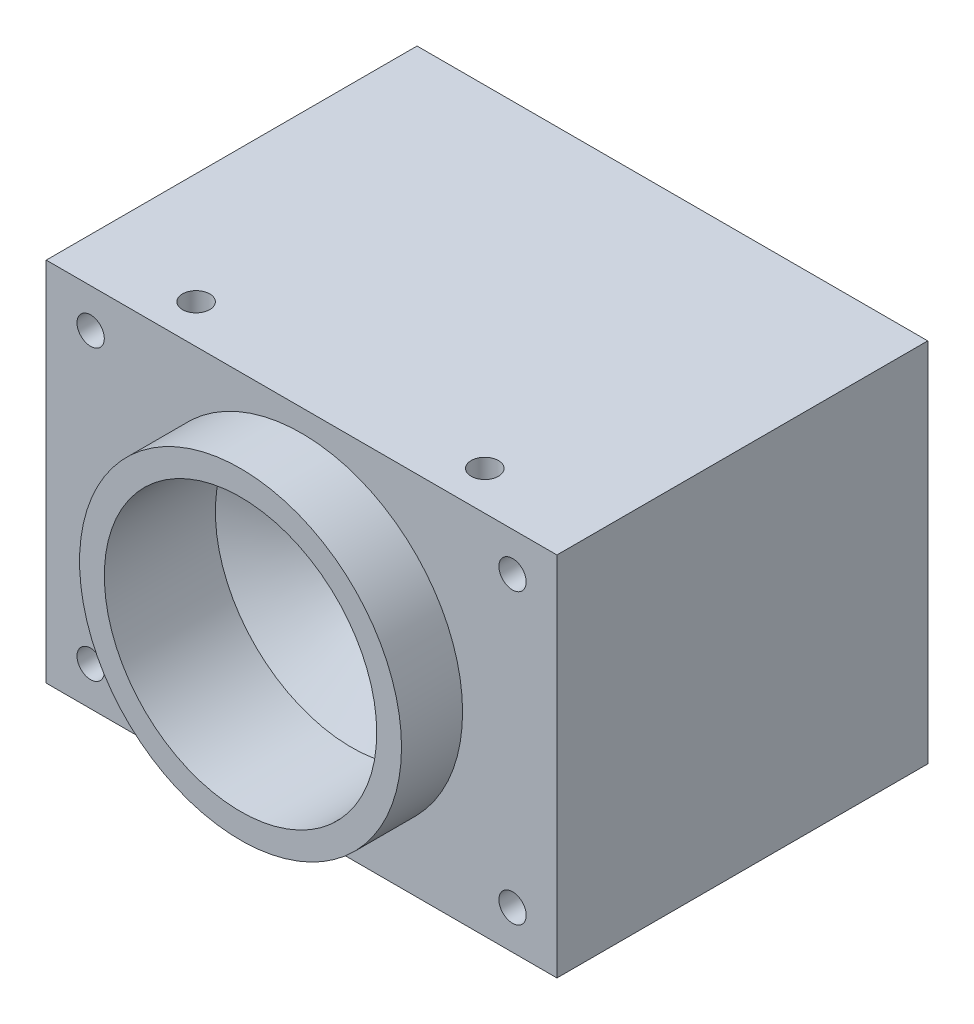
ISO-10303-21;
HEADER;
FILE_DESCRIPTION(('STEP AP214'),'2;1');
FILE_NAME('part.step','',(''),(''),'','','');
FILE_SCHEMA(('AUTOMOTIVE_DESIGN { 1 0 10303 214 1 1 1 1 }'));
ENDSEC;
DATA;
#1=APPLICATION_CONTEXT('core data for automotive mechanical design processes');
#2=APPLICATION_PROTOCOL_DEFINITION('international standard','automotive_design',2000,#1);
#3=PRODUCT_CONTEXT('',#1,'mechanical');
#4=PRODUCT('Part','Part','',(#3));
#5=PRODUCT_RELATED_PRODUCT_CATEGORY('part','',(#4));
#6=PRODUCT_DEFINITION_FORMATION('','',#4);
#7=PRODUCT_DEFINITION_CONTEXT('part definition',#1,'design');
#8=PRODUCT_DEFINITION('design','',#6,#7);
#9=PRODUCT_DEFINITION_SHAPE('','',#8);
#10=(LENGTH_UNIT() NAMED_UNIT(*) SI_UNIT(.MILLI.,.METRE.));
#11=(NAMED_UNIT(*) PLANE_ANGLE_UNIT() SI_UNIT($,.RADIAN.));
#12=(NAMED_UNIT(*) SI_UNIT($,.STERADIAN.) SOLID_ANGLE_UNIT());
#13=UNCERTAINTY_MEASURE_WITH_UNIT(LENGTH_MEASURE(1.E-05),#10,'distance_accuracy_value','');
#14=(GEOMETRIC_REPRESENTATION_CONTEXT(3) GLOBAL_UNCERTAINTY_ASSIGNED_CONTEXT((#13)) GLOBAL_UNIT_ASSIGNED_CONTEXT((#10,
#11,#12)) REPRESENTATION_CONTEXT('',''));
#15=CARTESIAN_POINT('',(0.,0.,0.));
#16=DIRECTION('',(0.,0.,1.));
#17=DIRECTION('',(1.,0.,0.));
#18=AXIS2_PLACEMENT_3D('',#15,#16,#17);
#19=CARTESIAN_POINT('',(0.,0.,28.9000000071837));
#20=DIRECTION('',(0.,0.,1.));
#21=DIRECTION('',(1.,0.,0.));
#22=AXIS2_PLACEMENT_3D('',#19,#20,#21);
#23=CONICAL_SURFACE('',#22,12.2679999955722,1.029744257486);
#24=CARTESIAN_POINT('',(-5.6843418860808E-11,0.,21.5286419158929));
#25=VERTEX_POINT('',#24);
#26=VERTEX_LOOP('',#25);
#27=FACE_BOUND('',#26,.T.);
#28=CARTESIAN_POINT('',(0.,0.,28.9));
#29=DIRECTION('',(0.,0.,1.));
#30=DIRECTION('',(1.,0.,0.));
#31=AXIS2_PLACEMENT_3D('',#28,#29,#30);
#32=CIRCLE('',#31,12.268);
#33=CARTESIAN_POINT('',(12.268,0.,28.9));
#34=VERTEX_POINT('',#33);
#35=EDGE_CURVE('E105',#34,#34,#32,.T.);
#36=ORIENTED_EDGE('',*,*,#35,.T.);
#37=EDGE_LOOP('',(#36));
#38=FACE_BOUND('',#37,.T.);
#39=ADVANCED_FACE('F16',(#27,#38),#23,.F.);
#40=CARTESIAN_POINT('',(0.,0.,33.9));
#41=DIRECTION('',(0.,0.,1.));
#42=DIRECTION('',(1.,0.,0.));
#43=AXIS2_PLACEMENT_3D('',#40,#41,#42);
#44=CYLINDRICAL_SURFACE('',#43,12.268);
#45=ORIENTED_EDGE('',*,*,#35,.F.);
#46=EDGE_LOOP('',(#45));
#47=FACE_BOUND('',#46,.T.);
#48=CARTESIAN_POINT('',(0.,0.,38.9));
#49=DIRECTION('',(0.,0.,1.));
#50=DIRECTION('',(1.,0.,0.));
#51=AXIS2_PLACEMENT_3D('',#48,#49,#50);
#52=CIRCLE('',#51,12.268);
#53=CARTESIAN_POINT('',(12.268,0.,38.9));
#54=VERTEX_POINT('',#53);
#55=EDGE_CURVE('E19',#54,#54,#52,.T.);
#56=ORIENTED_EDGE('',*,*,#55,.T.);
#57=EDGE_LOOP('',(#56));
#58=FACE_BOUND('',#57,.T.);
#59=ADVANCED_FACE('F102',(#47,#58),#44,.F.);
#60=CARTESIAN_POINT('',(-13.,12.5000000006708,29.9));
#61=DIRECTION('',(0.,1.,0.));
#62=DIRECTION('',(0.,0.,1.));
#63=AXIS2_PLACEMENT_3D('',#60,#61,#62);
#64=CONICAL_SURFACE('',#63,1.22949999942012,1.02974425728898);
#65=CARTESIAN_POINT('',(-13.0000000001473,11.7612418678732,29.9));
#66=VERTEX_POINT('',#65);
#67=VERTEX_LOOP('',#66);
#68=FACE_BOUND('',#67,.T.);
#69=CARTESIAN_POINT('',(-13.,12.5,29.9));
#70=DIRECTION('',(0.,1.,0.));
#71=DIRECTION('',(-1.,0.,0.));
#72=AXIS2_PLACEMENT_3D('',#69,#70,#71);
#73=CIRCLE('',#72,1.2295);
#74=CARTESIAN_POINT('',(-14.2295,12.5,29.9));
#75=VERTEX_POINT('',#74);
#76=EDGE_CURVE('E114',#75,#75,#73,.T.);
#77=ORIENTED_EDGE('',*,*,#76,.T.);
#78=EDGE_LOOP('',(#77));
#79=FACE_BOUND('',#78,.T.);
#80=ADVANCED_FACE('F198',(#68,#79),#64,.F.);
#81=CARTESIAN_POINT('',(13.,12.5000000006708,29.9));
#82=DIRECTION('',(0.,1.,0.));
#83=DIRECTION('',(0.,0.,1.));
#84=AXIS2_PLACEMENT_3D('',#81,#82,#83);
#85=CONICAL_SURFACE('',#84,1.22949999948743,1.02974425737128);
#86=CARTESIAN_POINT('',(12.99999999992,11.7612418678732,29.9));
#87=VERTEX_POINT('',#86);
#88=VERTEX_LOOP('',#87);
#89=FACE_BOUND('',#88,.T.);
#90=CARTESIAN_POINT('',(13.,12.5,29.9));
#91=DIRECTION('',(0.,1.,0.));
#92=DIRECTION('',(-1.,0.,0.));
#93=AXIS2_PLACEMENT_3D('',#90,#91,#92);
#94=CIRCLE('',#93,1.2295);
#95=CARTESIAN_POINT('',(11.7705,12.5,29.9));
#96=VERTEX_POINT('',#95);
#97=EDGE_CURVE('E186',#96,#96,#94,.T.);
#98=ORIENTED_EDGE('',*,*,#97,.T.);
#99=EDGE_LOOP('',(#98));
#100=FACE_BOUND('',#99,.T.);
#101=ADVANCED_FACE('F349',(#89,#100),#85,.F.);
#102=CARTESIAN_POINT('',(19.,13.,29.4000000007486));
#103=DIRECTION('',(0.,0.,1.));
#104=DIRECTION('',(1.,0.,0.));
#105=AXIS2_PLACEMENT_3D('',#102,#103,#104);
#106=CONICAL_SURFACE('',#105,1.22949999957291,1.0297442575171);
#107=CARTESIAN_POINT('',(19.0000000000623,13.,28.6612418680079));
#108=VERTEX_POINT('',#107);
#109=VERTEX_LOOP('',#108);
#110=FACE_BOUND('',#109,.T.);
#111=CARTESIAN_POINT('',(19.,13.,29.4));
#112=DIRECTION('',(0.,0.,1.));
#113=DIRECTION('',(1.,0.,0.));
#114=AXIS2_PLACEMENT_3D('',#111,#112,#113);
#115=CIRCLE('',#114,1.2295);
#116=CARTESIAN_POINT('',(20.2295,13.,29.4));
#117=VERTEX_POINT('',#116);
#118=EDGE_CURVE('E180',#117,#117,#115,.T.);
#119=ORIENTED_EDGE('',*,*,#118,.T.);
#120=EDGE_LOOP('',(#119));
#121=FACE_BOUND('',#120,.T.);
#122=ADVANCED_FACE('F345',(#110,#121),#106,.F.);
#123=CARTESIAN_POINT('',(19.,-13.,29.4000000007486));
#124=DIRECTION('',(0.,0.,1.));
#125=DIRECTION('',(1.,0.,0.));
#126=AXIS2_PLACEMENT_3D('',#123,#124,#125);
#127=CONICAL_SURFACE('',#126,1.22949999957292,1.0297442575171);
#128=CARTESIAN_POINT('',(19.0000000000623,-13.,28.6612418680079));
#129=VERTEX_POINT('',#128);
#130=VERTEX_LOOP('',#129);
#131=FACE_BOUND('',#130,.T.);
#132=CARTESIAN_POINT('',(19.,-13.,29.4));
#133=DIRECTION('',(0.,0.,1.));
#134=DIRECTION('',(1.,0.,0.));
#135=AXIS2_PLACEMENT_3D('',#132,#133,#134);
#136=CIRCLE('',#135,1.2295);
#137=CARTESIAN_POINT('',(20.2295,-13.,29.4));
#138=VERTEX_POINT('',#137);
#139=EDGE_CURVE('E168',#138,#138,#136,.T.);
#140=ORIENTED_EDGE('',*,*,#139,.T.);
#141=EDGE_LOOP('',(#140));
#142=FACE_BOUND('',#141,.T.);
#143=ADVANCED_FACE('F341',(#131,#142),#127,.F.);
#144=CARTESIAN_POINT('',(-19.,13.,29.4000000007486));
#145=DIRECTION('',(0.,0.,1.));
#146=DIRECTION('',(1.,0.,0.));
#147=AXIS2_PLACEMENT_3D('',#144,#145,#146);
#148=CONICAL_SURFACE('',#147,1.22949999950516,1.02974425749669);
#149=CARTESIAN_POINT('',(-18.9999999999486,13.,28.6612418680079));
#150=VERTEX_POINT('',#149);
#151=VERTEX_LOOP('',#150);
#152=FACE_BOUND('',#151,.T.);
#153=CARTESIAN_POINT('',(-19.,13.,29.4));
#154=DIRECTION('',(0.,0.,1.));
#155=DIRECTION('',(1.,0.,0.));
#156=AXIS2_PLACEMENT_3D('',#153,#154,#155);
#157=CIRCLE('',#156,1.2295);
#158=CARTESIAN_POINT('',(-17.7705,13.,29.4));
#159=VERTEX_POINT('',#158);
#160=EDGE_CURVE('E161',#159,#159,#157,.T.);
#161=ORIENTED_EDGE('',*,*,#160,.T.);
#162=EDGE_LOOP('',(#161));
#163=FACE_BOUND('',#162,.T.);
#164=ADVANCED_FACE('F337',(#152,#163),#148,.F.);
#165=CARTESIAN_POINT('',(-19.,-13.,29.4000000007486));
#166=DIRECTION('',(0.,0.,1.));
#167=DIRECTION('',(1.,0.,0.));
#168=AXIS2_PLACEMENT_3D('',#165,#166,#167);
#169=CONICAL_SURFACE('',#168,1.22949999950516,1.02974425749669);
#170=CARTESIAN_POINT('',(-18.9999999999486,-13.,28.6612418680079));
#171=VERTEX_POINT('',#170);
#172=VERTEX_LOOP('',#171);
#173=FACE_BOUND('',#172,.T.);
#174=CARTESIAN_POINT('',(-19.,-13.,29.4));
#175=DIRECTION('',(0.,0.,1.));
#176=DIRECTION('',(1.,0.,0.));
#177=AXIS2_PLACEMENT_3D('',#174,#175,#176);
#178=CIRCLE('',#177,1.2295);
#179=CARTESIAN_POINT('',(-17.7705,-13.,29.4));
#180=VERTEX_POINT('',#179);
#181=EDGE_CURVE('E155',#180,#180,#178,.T.);
#182=ORIENTED_EDGE('',*,*,#181,.T.);
#183=EDGE_LOOP('',(#182));
#184=FACE_BOUND('',#183,.T.);
#185=ADVANCED_FACE('F333',(#173,#184),#169,.F.);
#186=CARTESIAN_POINT('',(0.,0.,38.9));
#187=DIRECTION('',(0.,0.,-1.));
#188=DIRECTION('',(-1.,0.,0.));
#189=AXIS2_PLACEMENT_3D('',#186,#187,#188);
#190=PLANE('',#189);
#191=ORIENTED_EDGE('',*,*,#55,.F.);
#192=EDGE_LOOP('',(#191));
#193=FACE_BOUND('',#192,.T.);
#194=CARTESIAN_POINT('',(0.,0.,38.9));
#195=DIRECTION('',(0.,0.,1.));
#196=DIRECTION('',(1.,0.,0.));
#197=AXIS2_PLACEMENT_3D('',#194,#195,#196);
#198=CIRCLE('',#197,14.5);
#199=CARTESIAN_POINT('',(14.5,0.,38.9));
#200=VERTEX_POINT('',#199);
#201=EDGE_CURVE('E152',#200,#200,#198,.F.);
#202=ORIENTED_EDGE('',*,*,#201,.F.);
#203=EDGE_LOOP('',(#202));
#204=FACE_BOUND('',#203,.T.);
#205=ADVANCED_FACE('F204',(#193,#204),#190,.F.);
#206=CARTESIAN_POINT('',(-13.,14.5,29.9));
#207=DIRECTION('',(0.,1.,0.));
#208=DIRECTION('',(-1.,0.,0.));
#209=AXIS2_PLACEMENT_3D('',#206,#207,#208);
#210=CYLINDRICAL_SURFACE('',#209,1.2295);
#211=ORIENTED_EDGE('',*,*,#76,.F.);
#212=EDGE_LOOP('',(#211));
#213=FACE_BOUND('',#212,.T.);
#214=CARTESIAN_POINT('',(-13.,16.5,29.9));
#215=DIRECTION('',(0.,1.,0.));
#216=DIRECTION('',(-1.,0.,0.));
#217=AXIS2_PLACEMENT_3D('',#214,#215,#216);
#218=CIRCLE('',#217,1.2295);
#219=CARTESIAN_POINT('',(-14.2295,16.5,29.9));
#220=VERTEX_POINT('',#219);
#221=EDGE_CURVE('E149',#220,#220,#218,.F.);
#222=ORIENTED_EDGE('',*,*,#221,.F.);
#223=EDGE_LOOP('',(#222));
#224=FACE_BOUND('',#223,.T.);
#225=ADVANCED_FACE('F200',(#213,#224),#210,.F.);
#226=CARTESIAN_POINT('',(13.,14.5,29.9));
#227=DIRECTION('',(0.,1.,0.));
#228=DIRECTION('',(-1.,0.,0.));
#229=AXIS2_PLACEMENT_3D('',#226,#227,#228);
#230=CYLINDRICAL_SURFACE('',#229,1.2295);
#231=ORIENTED_EDGE('',*,*,#97,.F.);
#232=EDGE_LOOP('',(#231));
#233=FACE_BOUND('',#232,.T.);
#234=CARTESIAN_POINT('',(13.,16.5,29.9));
#235=DIRECTION('',(0.,1.,0.));
#236=DIRECTION('',(-1.,0.,0.));
#237=AXIS2_PLACEMENT_3D('',#234,#235,#236);
#238=CIRCLE('',#237,1.2295);
#239=CARTESIAN_POINT('',(11.7705,16.5,29.9));
#240=VERTEX_POINT('',#239);
#241=EDGE_CURVE('E146',#240,#240,#238,.F.);
#242=ORIENTED_EDGE('',*,*,#241,.F.);
#243=EDGE_LOOP('',(#242));
#244=FACE_BOUND('',#243,.T.);
#245=ADVANCED_FACE('F203',(#233,#244),#230,.F.);
#246=CARTESIAN_POINT('',(19.,13.,31.4));
#247=DIRECTION('',(0.,0.,1.));
#248=DIRECTION('',(1.,0.,0.));
#249=AXIS2_PLACEMENT_3D('',#246,#247,#248);
#250=CYLINDRICAL_SURFACE('',#249,1.2295);
#251=ORIENTED_EDGE('',*,*,#118,.F.);
#252=EDGE_LOOP('',(#251));
#253=FACE_BOUND('',#252,.T.);
#254=CARTESIAN_POINT('',(19.,13.,33.4));
#255=DIRECTION('',(0.,0.,1.));
#256=DIRECTION('',(1.,0.,0.));
#257=AXIS2_PLACEMENT_3D('',#254,#255,#256);
#258=CIRCLE('',#257,1.2295);
#259=CARTESIAN_POINT('',(20.2295,13.,33.4));
#260=VERTEX_POINT('',#259);
#261=EDGE_CURVE('E141',#260,#260,#258,.F.);
#262=ORIENTED_EDGE('',*,*,#261,.F.);
#263=EDGE_LOOP('',(#262));
#264=FACE_BOUND('',#263,.T.);
#265=ADVANCED_FACE('F324',(#253,#264),#250,.F.);
#266=CARTESIAN_POINT('',(19.,-13.,31.4));
#267=DIRECTION('',(0.,0.,1.));
#268=DIRECTION('',(1.,0.,0.));
#269=AXIS2_PLACEMENT_3D('',#266,#267,#268);
#270=CYLINDRICAL_SURFACE('',#269,1.2295);
#271=ORIENTED_EDGE('',*,*,#139,.F.);
#272=EDGE_LOOP('',(#271));
#273=FACE_BOUND('',#272,.T.);
#274=CARTESIAN_POINT('',(19.,-13.,33.4));
#275=DIRECTION('',(0.,0.,1.));
#276=DIRECTION('',(1.,0.,0.));
#277=AXIS2_PLACEMENT_3D('',#274,#275,#276);
#278=CIRCLE('',#277,1.2295);
#279=CARTESIAN_POINT('',(20.2295,-13.,33.4));
#280=VERTEX_POINT('',#279);
#281=EDGE_CURVE('E137',#280,#280,#278,.F.);
#282=ORIENTED_EDGE('',*,*,#281,.F.);
#283=EDGE_LOOP('',(#282));
#284=FACE_BOUND('',#283,.T.);
#285=ADVANCED_FACE('F320',(#273,#284),#270,.F.);
#286=CARTESIAN_POINT('',(-19.,13.,31.4));
#287=DIRECTION('',(0.,0.,1.));
#288=DIRECTION('',(1.,0.,0.));
#289=AXIS2_PLACEMENT_3D('',#286,#287,#288);
#290=CYLINDRICAL_SURFACE('',#289,1.2295);
#291=ORIENTED_EDGE('',*,*,#160,.F.);
#292=EDGE_LOOP('',(#291));
#293=FACE_BOUND('',#292,.T.);
#294=CARTESIAN_POINT('',(-19.,13.,33.4));
#295=DIRECTION('',(0.,0.,1.));
#296=DIRECTION('',(1.,0.,0.));
#297=AXIS2_PLACEMENT_3D('',#294,#295,#296);
#298=CIRCLE('',#297,1.2295);
#299=CARTESIAN_POINT('',(-17.7705,13.,33.4));
#300=VERTEX_POINT('',#299);
#301=EDGE_CURVE('E133',#300,#300,#298,.F.);
#302=ORIENTED_EDGE('',*,*,#301,.F.);
#303=EDGE_LOOP('',(#302));
#304=FACE_BOUND('',#303,.T.);
#305=ADVANCED_FACE('F316',(#293,#304),#290,.F.);
#306=CARTESIAN_POINT('',(-19.,-13.,31.4));
#307=DIRECTION('',(0.,0.,1.));
#308=DIRECTION('',(1.,0.,0.));
#309=AXIS2_PLACEMENT_3D('',#306,#307,#308);
#310=CYLINDRICAL_SURFACE('',#309,1.2295);
#311=ORIENTED_EDGE('',*,*,#181,.F.);
#312=EDGE_LOOP('',(#311));
#313=FACE_BOUND('',#312,.T.);
#314=CARTESIAN_POINT('',(-19.,-13.,33.4));
#315=DIRECTION('',(0.,0.,1.));
#316=DIRECTION('',(1.,0.,0.));
#317=AXIS2_PLACEMENT_3D('',#314,#315,#316);
#318=CIRCLE('',#317,1.2295);
#319=CARTESIAN_POINT('',(-17.7705,-13.,33.4));
#320=VERTEX_POINT('',#319);
#321=EDGE_CURVE('E129',#320,#320,#318,.F.);
#322=ORIENTED_EDGE('',*,*,#321,.F.);
#323=EDGE_LOOP('',(#322));
#324=FACE_BOUND('',#323,.T.);
#325=ADVANCED_FACE('F312',(#313,#324),#310,.F.);
#326=CARTESIAN_POINT('',(0.,0.,33.4));
#327=DIRECTION('',(0.,0.,1.));
#328=DIRECTION('',(1.,0.,0.));
#329=AXIS2_PLACEMENT_3D('',#326,#327,#328);
#330=CYLINDRICAL_SURFACE('',#329,14.5);
#331=CARTESIAN_POINT('',(0.,0.,33.4));
#332=DIRECTION('',(0.,0.,1.));
#333=DIRECTION('',(1.,0.,0.));
#334=AXIS2_PLACEMENT_3D('',#331,#332,#333);
#335=CIRCLE('',#334,14.5);
#336=CARTESIAN_POINT('',(14.5,0.,33.4));
#337=VERTEX_POINT('',#336);
#338=EDGE_CURVE('E125',#337,#337,#335,.F.);
#339=ORIENTED_EDGE('',*,*,#338,.F.);
#340=EDGE_LOOP('',(#339));
#341=FACE_BOUND('',#340,.T.);
#342=ORIENTED_EDGE('',*,*,#201,.T.);
#343=EDGE_LOOP('',(#342));
#344=FACE_BOUND('',#343,.T.);
#345=ADVANCED_FACE('F212',(#341,#344),#330,.T.);
#346=CARTESIAN_POINT('',(-23.,16.5,0.));
#347=DIRECTION('',(0.,1.,0.));
#348=DIRECTION('',(0.,0.,1.));
#349=AXIS2_PLACEMENT_3D('',#346,#347,#348);
#350=PLANE('',#349);
#351=ORIENTED_EDGE('',*,*,#241,.T.);
#352=EDGE_LOOP('',(#351));
#353=FACE_BOUND('',#352,.T.);
#354=ORIENTED_EDGE('',*,*,#221,.T.);
#355=EDGE_LOOP('',(#354));
#356=FACE_BOUND('',#355,.T.);
#357=DIRECTION('',(1.,0.,0.));
#358=VECTOR('',#357,1.);
#359=CARTESIAN_POINT('',(0.,16.5,0.));
#360=LINE('',#359,#358);
#361=CARTESIAN_POINT('',(23.,16.5,0.));
#362=VERTEX_POINT('',#361);
#363=CARTESIAN_POINT('',(-23.,16.5,0.));
#364=VERTEX_POINT('',#363);
#365=EDGE_CURVE('E217',#362,#364,#360,.F.);
#366=ORIENTED_EDGE('',*,*,#365,.T.);
#367=DIRECTION('',(0.,0.,1.));
#368=VECTOR('',#367,1.);
#369=CARTESIAN_POINT('',(-23.,16.5,0.));
#370=LINE('',#369,#368);
#371=CARTESIAN_POINT('',(-23.,16.5,33.4));
#372=VERTEX_POINT('',#371);
#373=EDGE_CURVE('E219',#372,#364,#370,.F.);
#374=ORIENTED_EDGE('',*,*,#373,.F.);
#375=DIRECTION('',(1.,0.,0.));
#376=VECTOR('',#375,1.);
#377=CARTESIAN_POINT('',(0.,16.5,33.4));
#378=LINE('',#377,#376);
#379=CARTESIAN_POINT('',(23.,16.5,33.4));
#380=VERTEX_POINT('',#379);
#381=EDGE_CURVE('E145',#380,#372,#378,.F.);
#382=ORIENTED_EDGE('',*,*,#381,.F.);
#383=DIRECTION('',(0.,0.,-1.));
#384=VECTOR('',#383,1.);
#385=CARTESIAN_POINT('',(23.,16.5,0.));
#386=LINE('',#385,#384);
#387=EDGE_CURVE('E222',#362,#380,#386,.F.);
#388=ORIENTED_EDGE('',*,*,#387,.F.);
#389=EDGE_LOOP('',(#366,#374,#382,#388));
#390=FACE_BOUND('',#389,.T.);
#391=ADVANCED_FACE('F208',(#353,#356,#390),#350,.T.);
#392=CARTESIAN_POINT('',(-13.,-12.5000000006708,29.9));
#393=DIRECTION('',(0.,-1.,0.));
#394=DIRECTION('',(0.,0.,-1.));
#395=AXIS2_PLACEMENT_3D('',#392,#393,#394);
#396=CONICAL_SURFACE('',#395,1.22949999942012,1.02974425728898);
#397=CARTESIAN_POINT('',(-13.0000000001473,-11.7612418678732,29.9));
#398=VERTEX_POINT('',#397);
#399=VERTEX_LOOP('',#398);
#400=FACE_BOUND('',#399,.T.);
#401=CARTESIAN_POINT('',(-13.,-12.5,29.9));
#402=DIRECTION('',(0.,-1.,0.));
#403=DIRECTION('',(0.,0.,-1.));
#404=AXIS2_PLACEMENT_3D('',#401,#402,#403);
#405=CIRCLE('',#404,1.2295);
#406=CARTESIAN_POINT('',(-13.,-12.5,28.6705));
#407=VERTEX_POINT('',#406);
#408=EDGE_CURVE('E255',#407,#407,#405,.T.);
#409=ORIENTED_EDGE('',*,*,#408,.T.);
#410=EDGE_LOOP('',(#409));
#411=FACE_BOUND('',#410,.T.);
#412=ADVANCED_FACE('F211',(#400,#411),#396,.F.);
#413=CARTESIAN_POINT('',(13.,-12.5000000006708,29.9));
#414=DIRECTION('',(0.,-1.,0.));
#415=DIRECTION('',(0.,0.,-1.));
#416=AXIS2_PLACEMENT_3D('',#413,#414,#415);
#417=CONICAL_SURFACE('',#416,1.22949999948742,1.02974425737128);
#418=CARTESIAN_POINT('',(12.99999999992,-11.7612418678732,29.9));
#419=VERTEX_POINT('',#418);
#420=VERTEX_LOOP('',#419);
#421=FACE_BOUND('',#420,.T.);
#422=CARTESIAN_POINT('',(13.,-12.5,29.9));
#423=DIRECTION('',(0.,-1.,0.));
#424=DIRECTION('',(0.,0.,-1.));
#425=AXIS2_PLACEMENT_3D('',#422,#423,#424);
#426=CIRCLE('',#425,1.2295);
#427=CARTESIAN_POINT('',(13.,-12.5,28.6705));
#428=VERTEX_POINT('',#427);
#429=EDGE_CURVE('E258',#428,#428,#426,.T.);
#430=ORIENTED_EDGE('',*,*,#429,.T.);
#431=EDGE_LOOP('',(#430));
#432=FACE_BOUND('',#431,.T.);
#433=ADVANCED_FACE('F302',(#421,#432),#417,.F.);
#434=CARTESIAN_POINT('',(0.,0.,33.4));
#435=DIRECTION('',(0.,0.,1.));
#436=DIRECTION('',(1.,0.,0.));
#437=AXIS2_PLACEMENT_3D('',#434,#435,#436);
#438=PLANE('',#437);
#439=ORIENTED_EDGE('',*,*,#338,.T.);
#440=EDGE_LOOP('',(#439));
#441=FACE_BOUND('',#440,.T.);
#442=ORIENTED_EDGE('',*,*,#321,.T.);
#443=EDGE_LOOP('',(#442));
#444=FACE_BOUND('',#443,.T.);
#445=ORIENTED_EDGE('',*,*,#301,.T.);
#446=EDGE_LOOP('',(#445));
#447=FACE_BOUND('',#446,.T.);
#448=ORIENTED_EDGE('',*,*,#281,.T.);
#449=EDGE_LOOP('',(#448));
#450=FACE_BOUND('',#449,.T.);
#451=ORIENTED_EDGE('',*,*,#261,.T.);
#452=EDGE_LOOP('',(#451));
#453=FACE_BOUND('',#452,.T.);
#454=DIRECTION('',(0.,1.,0.));
#455=VECTOR('',#454,1.);
#456=CARTESIAN_POINT('',(23.,16.5,33.4));
#457=LINE('',#456,#455);
#458=CARTESIAN_POINT('',(23.,-16.5,33.4));
#459=VERTEX_POINT('',#458);
#460=EDGE_CURVE('E237',#380,#459,#457,.F.);
#461=ORIENTED_EDGE('',*,*,#460,.F.);
#462=ORIENTED_EDGE('',*,*,#381,.T.);
#463=DIRECTION('',(0.,1.,0.));
#464=VECTOR('',#463,1.);
#465=CARTESIAN_POINT('',(-23.,-16.5,33.4));
#466=LINE('',#465,#464);
#467=CARTESIAN_POINT('',(-23.,-16.5,33.4));
#468=VERTEX_POINT('',#467);
#469=EDGE_CURVE('E128',#468,#372,#466,.T.);
#470=ORIENTED_EDGE('',*,*,#469,.F.);
#471=DIRECTION('',(1.,0.,0.));
#472=VECTOR('',#471,1.);
#473=CARTESIAN_POINT('',(23.,-16.5,33.4));
#474=LINE('',#473,#472);
#475=EDGE_CURVE('E250',#459,#468,#474,.F.);
#476=ORIENTED_EDGE('',*,*,#475,.F.);
#477=EDGE_LOOP('',(#461,#462,#470,#476));
#478=FACE_BOUND('',#477,.T.);
#479=ADVANCED_FACE('F248',(#441,#444,#447,#450,#453,#478),#438,.T.);
#480=CARTESIAN_POINT('',(-23.,-16.5,0.));
#481=DIRECTION('',(-1.,0.,0.));
#482=DIRECTION('',(0.,0.,1.));
#483=AXIS2_PLACEMENT_3D('',#480,#481,#482);
#484=PLANE('',#483);
#485=DIRECTION('',(0.,1.,0.));
#486=VECTOR('',#485,1.);
#487=CARTESIAN_POINT('',(-23.,0.,0.));
#488=LINE('',#487,#486);
#489=CARTESIAN_POINT('',(-23.,-16.5,0.));
#490=VERTEX_POINT('',#489);
#491=EDGE_CURVE('E225',#364,#490,#488,.F.);
#492=ORIENTED_EDGE('',*,*,#491,.T.);
#493=DIRECTION('',(0.,0.,-1.));
#494=VECTOR('',#493,1.);
#495=CARTESIAN_POINT('',(-23.,-16.5,0.));
#496=LINE('',#495,#494);
#497=EDGE_CURVE('E271',#468,#490,#496,.T.);
#498=ORIENTED_EDGE('',*,*,#497,.F.);
#499=ORIENTED_EDGE('',*,*,#469,.T.);
#500=ORIENTED_EDGE('',*,*,#373,.T.);
#501=EDGE_LOOP('',(#492,#498,#499,#500));
#502=FACE_BOUND('',#501,.T.);
#503=ADVANCED_FACE('F228',(#502),#484,.T.);
#504=CARTESIAN_POINT('',(0.,0.,0.));
#505=DIRECTION('',(0.,0.,1.));
#506=DIRECTION('',(1.,0.,0.));
#507=AXIS2_PLACEMENT_3D('',#504,#505,#506);
#508=PLANE('',#507);
#509=ORIENTED_EDGE('',*,*,#491,.F.);
#510=ORIENTED_EDGE('',*,*,#365,.F.);
#511=DIRECTION('',(0.,1.,0.));
#512=VECTOR('',#511,1.);
#513=CARTESIAN_POINT('',(23.,16.5,0.));
#514=LINE('',#513,#512);
#515=CARTESIAN_POINT('',(23.,-16.5,0.));
#516=VERTEX_POINT('',#515);
#517=EDGE_CURVE('E39',#516,#362,#514,.T.);
#518=ORIENTED_EDGE('',*,*,#517,.F.);
#519=DIRECTION('',(1.,0.,0.));
#520=VECTOR('',#519,1.);
#521=CARTESIAN_POINT('',(23.,-16.5,0.));
#522=LINE('',#521,#520);
#523=EDGE_CURVE('E234',#490,#516,#522,.T.);
#524=ORIENTED_EDGE('',*,*,#523,.F.);
#525=EDGE_LOOP('',(#509,#510,#518,#524));
#526=FACE_BOUND('',#525,.T.);
#527=ADVANCED_FACE('F232',(#526),#508,.F.);
#528=CARTESIAN_POINT('',(23.,16.5,0.));
#529=DIRECTION('',(1.,0.,0.));
#530=DIRECTION('',(0.,0.,-1.));
#531=AXIS2_PLACEMENT_3D('',#528,#529,#530);
#532=PLANE('',#531);
#533=ORIENTED_EDGE('',*,*,#517,.T.);
#534=ORIENTED_EDGE('',*,*,#387,.T.);
#535=ORIENTED_EDGE('',*,*,#460,.T.);
#536=DIRECTION('',(0.,0.,-1.));
#537=VECTOR('',#536,1.);
#538=CARTESIAN_POINT('',(23.,-16.5,0.));
#539=LINE('',#538,#537);
#540=EDGE_CURVE('E124',#516,#459,#539,.F.);
#541=ORIENTED_EDGE('',*,*,#540,.F.);
#542=EDGE_LOOP('',(#533,#534,#535,#541));
#543=FACE_BOUND('',#542,.T.);
#544=ADVANCED_FACE('F253',(#543),#532,.T.);
#545=CARTESIAN_POINT('',(-13.,-14.5,29.9));
#546=DIRECTION('',(0.,-1.,0.));
#547=DIRECTION('',(0.,0.,-1.));
#548=AXIS2_PLACEMENT_3D('',#545,#546,#547);
#549=CYLINDRICAL_SURFACE('',#548,1.2295);
#550=ORIENTED_EDGE('',*,*,#408,.F.);
#551=EDGE_LOOP('',(#550));
#552=FACE_BOUND('',#551,.T.);
#553=CARTESIAN_POINT('',(-13.,-16.5,29.9));
#554=DIRECTION('',(0.,-1.,0.));
#555=DIRECTION('',(0.,0.,-1.));
#556=AXIS2_PLACEMENT_3D('',#553,#554,#555);
#557=CIRCLE('',#556,1.2295);
#558=CARTESIAN_POINT('',(-13.,-16.5,28.6705));
#559=VERTEX_POINT('',#558);
#560=EDGE_CURVE('E26',#559,#559,#557,.F.);
#561=ORIENTED_EDGE('',*,*,#560,.F.);
#562=EDGE_LOOP('',(#561));
#563=FACE_BOUND('',#562,.T.);
#564=ADVANCED_FACE('F287',(#552,#563),#549,.F.);
#565=CARTESIAN_POINT('',(13.,-14.5,29.9));
#566=DIRECTION('',(0.,-1.,0.));
#567=DIRECTION('',(0.,0.,-1.));
#568=AXIS2_PLACEMENT_3D('',#565,#566,#567);
#569=CYLINDRICAL_SURFACE('',#568,1.2295);
#570=ORIENTED_EDGE('',*,*,#429,.F.);
#571=EDGE_LOOP('',(#570));
#572=FACE_BOUND('',#571,.T.);
#573=CARTESIAN_POINT('',(13.,-16.5,29.9));
#574=DIRECTION('',(0.,-1.,0.));
#575=DIRECTION('',(0.,0.,-1.));
#576=AXIS2_PLACEMENT_3D('',#573,#574,#575);
#577=CIRCLE('',#576,1.2295);
#578=CARTESIAN_POINT('',(13.,-16.5,28.6705));
#579=VERTEX_POINT('',#578);
#580=EDGE_CURVE('E11',#579,#579,#577,.F.);
#581=ORIENTED_EDGE('',*,*,#580,.F.);
#582=EDGE_LOOP('',(#581));
#583=FACE_BOUND('',#582,.T.);
#584=ADVANCED_FACE('F279',(#572,#583),#569,.F.);
#585=CARTESIAN_POINT('',(23.,-16.5,0.));
#586=DIRECTION('',(0.,-1.,0.));
#587=DIRECTION('',(0.,0.,-1.));
#588=AXIS2_PLACEMENT_3D('',#585,#586,#587);
#589=PLANE('',#588);
#590=ORIENTED_EDGE('',*,*,#580,.T.);
#591=EDGE_LOOP('',(#590));
#592=FACE_BOUND('',#591,.T.);
#593=ORIENTED_EDGE('',*,*,#560,.T.);
#594=EDGE_LOOP('',(#593));
#595=FACE_BOUND('',#594,.T.);
#596=ORIENTED_EDGE('',*,*,#523,.T.);
#597=ORIENTED_EDGE('',*,*,#540,.T.);
#598=ORIENTED_EDGE('',*,*,#475,.T.);
#599=ORIENTED_EDGE('',*,*,#497,.T.);
#600=EDGE_LOOP('',(#596,#597,#598,#599));
#601=FACE_BOUND('',#600,.T.);
#602=ADVANCED_FACE('F277',(#592,#595,#601),#589,.T.);
#603=CLOSED_SHELL('',(#39,#59,#80,#101,#122,#143,#164,#185,#205,#225,#245,#265,#285,#305,#325,
#345,#391,#412,#433,#479,#503,#527,#544,#564,#584,#602));
#604=MANIFOLD_SOLID_BREP('B1',#603);
#605=ADVANCED_BREP_SHAPE_REPRESENTATION('',(#18,#604),#14);
#606=SHAPE_DEFINITION_REPRESENTATION(#9,#605);
ENDSEC;
END-ISO-10303-21;
